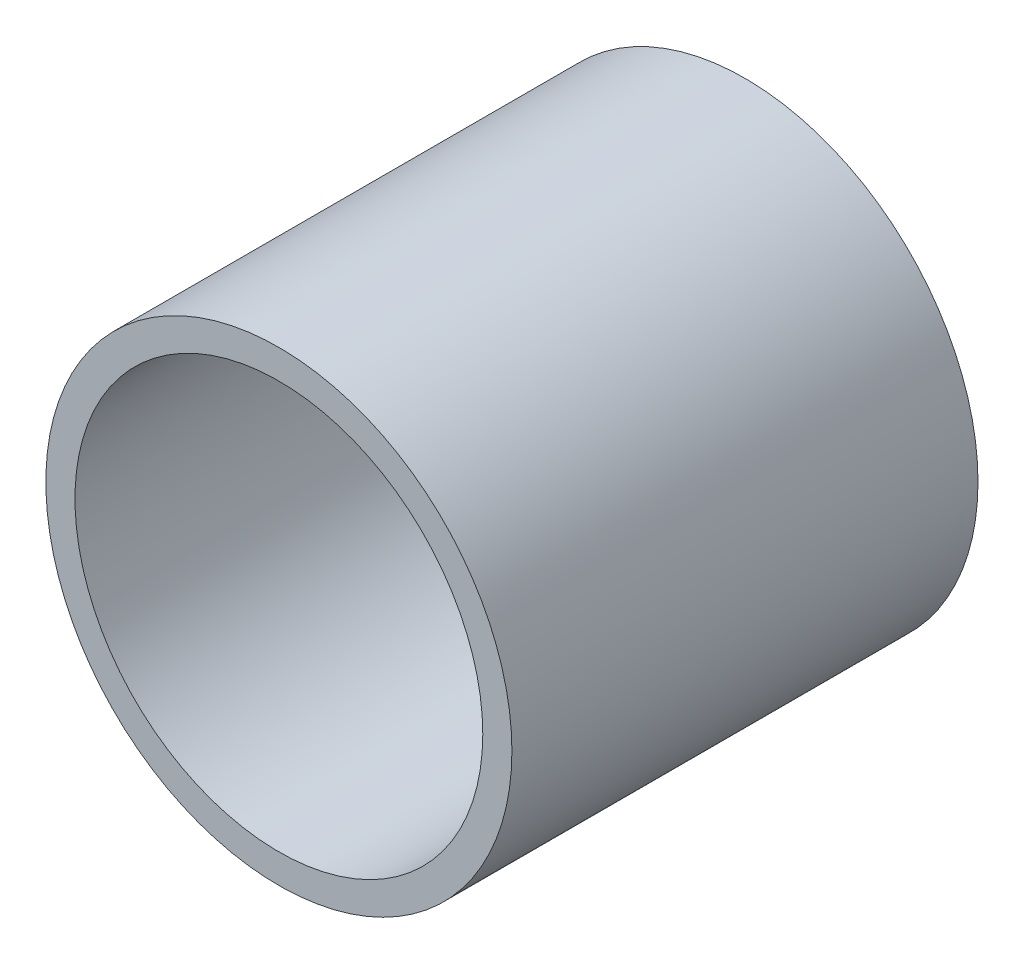
ISO-10303-21;
HEADER;
FILE_DESCRIPTION(('STEP AP214'),'2;1');
FILE_NAME('part.step','',(''),(''),'','','');
FILE_SCHEMA(('AUTOMOTIVE_DESIGN { 1 0 10303 214 1 1 1 1 }'));
ENDSEC;
DATA;
#1=APPLICATION_CONTEXT('core data for automotive mechanical design processes');
#2=APPLICATION_PROTOCOL_DEFINITION('international standard','automotive_design',2000,#1);
#3=PRODUCT_CONTEXT('',#1,'mechanical');
#4=PRODUCT('Part','Part','',(#3));
#5=PRODUCT_RELATED_PRODUCT_CATEGORY('part','',(#4));
#6=PRODUCT_DEFINITION_FORMATION('','',#4);
#7=PRODUCT_DEFINITION_CONTEXT('part definition',#1,'design');
#8=PRODUCT_DEFINITION('design','',#6,#7);
#9=PRODUCT_DEFINITION_SHAPE('','',#8);
#10=(LENGTH_UNIT() NAMED_UNIT(*) SI_UNIT(.MILLI.,.METRE.));
#11=(NAMED_UNIT(*) PLANE_ANGLE_UNIT() SI_UNIT($,.RADIAN.));
#12=(NAMED_UNIT(*) SI_UNIT($,.STERADIAN.) SOLID_ANGLE_UNIT());
#13=UNCERTAINTY_MEASURE_WITH_UNIT(LENGTH_MEASURE(1.E-05),#10,'distance_accuracy_value','');
#14=(GEOMETRIC_REPRESENTATION_CONTEXT(3) GLOBAL_UNCERTAINTY_ASSIGNED_CONTEXT((#13)) GLOBAL_UNIT_ASSIGNED_CONTEXT((#10,
#11,#12)) REPRESENTATION_CONTEXT('',''));
#15=CARTESIAN_POINT('',(0.,0.,0.));
#16=DIRECTION('',(0.,0.,1.));
#17=DIRECTION('',(1.,0.,0.));
#18=AXIS2_PLACEMENT_3D('',#15,#16,#17);
#19=CARTESIAN_POINT('',(0.,0.,8.));
#20=DIRECTION('',(0.,0.,1.));
#21=DIRECTION('',(1.,0.,0.));
#22=AXIS2_PLACEMENT_3D('',#19,#20,#21);
#23=PLANE('',#22);
#24=CARTESIAN_POINT('',(0.,0.,8.));
#25=DIRECTION('',(0.,0.,1.));
#26=DIRECTION('',(1.,0.,0.));
#27=AXIS2_PLACEMENT_3D('',#24,#25,#26);
#28=CIRCLE('',#27,4.);
#29=CARTESIAN_POINT('',(4.,0.,8.));
#30=VERTEX_POINT('',#29);
#31=EDGE_CURVE('E10',#30,#30,#28,.T.);
#32=ORIENTED_EDGE('',*,*,#31,.T.);
#33=EDGE_LOOP('',(#32));
#34=FACE_BOUND('',#33,.T.);
#35=CARTESIAN_POINT('',(0.,0.,8.));
#36=DIRECTION('',(0.,0.,1.));
#37=DIRECTION('',(1.,0.,0.));
#38=AXIS2_PLACEMENT_3D('',#35,#36,#37);
#39=CIRCLE('',#38,3.5);
#40=CARTESIAN_POINT('',(3.5,0.,8.));
#41=VERTEX_POINT('',#40);
#42=EDGE_CURVE('E43',#41,#41,#39,.T.);
#43=ORIENTED_EDGE('',*,*,#42,.F.);
#44=EDGE_LOOP('',(#43));
#45=FACE_BOUND('',#44,.T.);
#46=ADVANCED_FACE('F32',(#34,#45),#23,.T.);
#47=CARTESIAN_POINT('',(0.,0.,0.));
#48=DIRECTION('',(0.,0.,1.));
#49=DIRECTION('',(1.,0.,0.));
#50=AXIS2_PLACEMENT_3D('',#47,#48,#49);
#51=PLANE('',#50);
#52=CARTESIAN_POINT('',(0.,0.,0.));
#53=DIRECTION('',(0.,0.,1.));
#54=DIRECTION('',(1.,0.,0.));
#55=AXIS2_PLACEMENT_3D('',#52,#53,#54);
#56=CIRCLE('',#55,4.);
#57=CARTESIAN_POINT('',(4.,0.,0.));
#58=VERTEX_POINT('',#57);
#59=EDGE_CURVE('E36',#58,#58,#56,.T.);
#60=ORIENTED_EDGE('',*,*,#59,.F.);
#61=EDGE_LOOP('',(#60));
#62=FACE_BOUND('',#61,.T.);
#63=CARTESIAN_POINT('',(0.,0.,0.));
#64=DIRECTION('',(0.,0.,1.));
#65=DIRECTION('',(1.,0.,0.));
#66=AXIS2_PLACEMENT_3D('',#63,#64,#65);
#67=CIRCLE('',#66,3.5);
#68=CARTESIAN_POINT('',(3.5,0.,0.));
#69=VERTEX_POINT('',#68);
#70=EDGE_CURVE('E45',#69,#69,#67,.T.);
#71=ORIENTED_EDGE('',*,*,#70,.T.);
#72=EDGE_LOOP('',(#71));
#73=FACE_BOUND('',#72,.T.);
#74=ADVANCED_FACE('F55',(#62,#73),#51,.F.);
#75=CARTESIAN_POINT('',(0.,0.,8.));
#76=DIRECTION('',(0.,0.,-1.));
#77=DIRECTION('',(-1.,0.,0.));
#78=AXIS2_PLACEMENT_3D('',#75,#76,#77);
#79=CYLINDRICAL_SURFACE('',#78,4.);
#80=ORIENTED_EDGE('',*,*,#31,.F.);
#81=EDGE_LOOP('',(#80));
#82=FACE_BOUND('',#81,.T.);
#83=ORIENTED_EDGE('',*,*,#59,.T.);
#84=EDGE_LOOP('',(#83));
#85=FACE_BOUND('',#84,.T.);
#86=ADVANCED_FACE('F34',(#82,#85),#79,.T.);
#87=CARTESIAN_POINT('',(0.,0.,8.));
#88=DIRECTION('',(0.,0.,-1.));
#89=DIRECTION('',(-1.,0.,0.));
#90=AXIS2_PLACEMENT_3D('',#87,#88,#89);
#91=CYLINDRICAL_SURFACE('',#90,3.5);
#92=ORIENTED_EDGE('',*,*,#42,.T.);
#93=EDGE_LOOP('',(#92));
#94=FACE_BOUND('',#93,.T.);
#95=ORIENTED_EDGE('',*,*,#70,.F.);
#96=EDGE_LOOP('',(#95));
#97=FACE_BOUND('',#96,.T.);
#98=ADVANCED_FACE('F51',(#94,#97),#91,.F.);
#99=CLOSED_SHELL('',(#46,#74,#86,#98));
#100=MANIFOLD_SOLID_BREP('B2',#99);
#101=ADVANCED_BREP_SHAPE_REPRESENTATION('',(#18,#100),#14);
#102=SHAPE_DEFINITION_REPRESENTATION(#9,#101);
ENDSEC;
END-ISO-10303-21;
